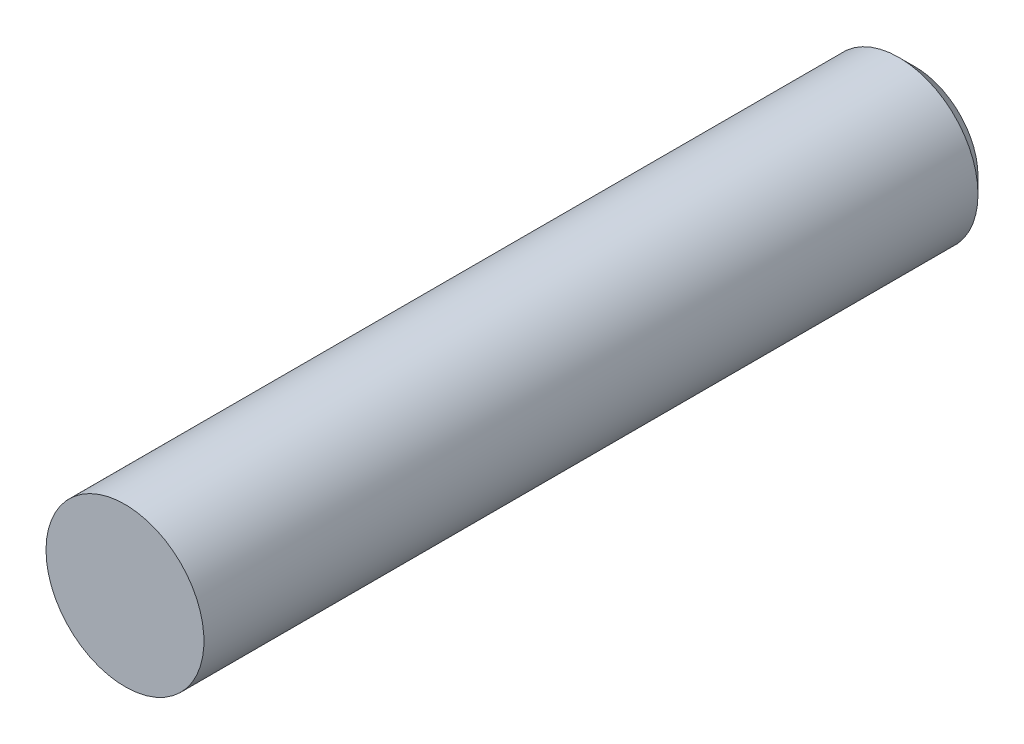
ISO-10303-21;
HEADER;
FILE_DESCRIPTION(('STEP AP214'),'2;1');
FILE_NAME('part.step','',(''),(''),'','','');
FILE_SCHEMA(('AUTOMOTIVE_DESIGN { 1 0 10303 214 1 1 1 1 }'));
ENDSEC;
DATA;
#1=APPLICATION_CONTEXT('core data for automotive mechanical design processes');
#2=APPLICATION_PROTOCOL_DEFINITION('international standard','automotive_design',2000,#1);
#3=PRODUCT_CONTEXT('',#1,'mechanical');
#4=PRODUCT('Part','Part','',(#3));
#5=PRODUCT_RELATED_PRODUCT_CATEGORY('part','',(#4));
#6=PRODUCT_DEFINITION_FORMATION('','',#4);
#7=PRODUCT_DEFINITION_CONTEXT('part definition',#1,'design');
#8=PRODUCT_DEFINITION('design','',#6,#7);
#9=PRODUCT_DEFINITION_SHAPE('','',#8);
#10=(LENGTH_UNIT() NAMED_UNIT(*) SI_UNIT(.MILLI.,.METRE.));
#11=(NAMED_UNIT(*) PLANE_ANGLE_UNIT() SI_UNIT($,.RADIAN.));
#12=(NAMED_UNIT(*) SI_UNIT($,.STERADIAN.) SOLID_ANGLE_UNIT());
#13=UNCERTAINTY_MEASURE_WITH_UNIT(LENGTH_MEASURE(1.E-05),#10,'distance_accuracy_value','');
#14=(GEOMETRIC_REPRESENTATION_CONTEXT(3) GLOBAL_UNCERTAINTY_ASSIGNED_CONTEXT((#13)) GLOBAL_UNIT_ASSIGNED_CONTEXT((#10,
#11,#12)) REPRESENTATION_CONTEXT('',''));
#15=CARTESIAN_POINT('',(0.,0.,0.));
#16=DIRECTION('',(0.,0.,1.));
#17=DIRECTION('',(1.,0.,0.));
#18=AXIS2_PLACEMENT_3D('',#15,#16,#17);
#19=CARTESIAN_POINT('',(0.,0.,100.));
#20=DIRECTION('',(0.,0.,-1.));
#21=DIRECTION('',(-1.,0.,0.));
#22=AXIS2_PLACEMENT_3D('',#19,#20,#21);
#23=CYLINDRICAL_SURFACE('',#22,2.5);
#24=CARTESIAN_POINT('',(0.,0.,-75.));
#25=DIRECTION('',(0.,0.,-1.));
#26=DIRECTION('',(-1.,0.,0.));
#27=AXIS2_PLACEMENT_3D('',#24,#25,#26);
#28=CIRCLE('',#27,2.5);
#29=CARTESIAN_POINT('',(-2.5,0.,-75.));
#30=VERTEX_POINT('',#29);
#31=EDGE_CURVE('E35',#30,#30,#28,.T.);
#32=ORIENTED_EDGE('',*,*,#31,.T.);
#33=EDGE_LOOP('',(#32));
#34=FACE_BOUND('',#33,.T.);
#35=CARTESIAN_POINT('',(0.,0.,-99.5));
#36=DIRECTION('',(0.,0.,1.));
#37=DIRECTION('',(1.,0.,0.));
#38=AXIS2_PLACEMENT_3D('',#35,#36,#37);
#39=CIRCLE('',#38,2.5);
#40=CARTESIAN_POINT('',(2.5,0.,-99.5));
#41=VERTEX_POINT('',#40);
#42=EDGE_CURVE('E39',#41,#41,#39,.T.);
#43=ORIENTED_EDGE('',*,*,#42,.T.);
#44=EDGE_LOOP('',(#43));
#45=FACE_BOUND('',#44,.T.);
#46=ADVANCED_FACE('F31',(#34,#45),#23,.T.);
#47=CARTESIAN_POINT('',(0.,0.,-100.));
#48=DIRECTION('',(0.,0.,1.));
#49=DIRECTION('',(1.,0.,0.));
#50=AXIS2_PLACEMENT_3D('',#47,#48,#49);
#51=PLANE('',#50);
#52=CARTESIAN_POINT('',(0.,0.,-100.));
#53=DIRECTION('',(0.,0.,1.));
#54=DIRECTION('',(1.,0.,0.));
#55=AXIS2_PLACEMENT_3D('',#52,#53,#54);
#56=CIRCLE('',#55,1.99999999999997);
#57=CARTESIAN_POINT('',(1.99999999999997,0.,-100.));
#58=VERTEX_POINT('',#57);
#59=EDGE_CURVE('E10',#58,#58,#56,.F.);
#60=ORIENTED_EDGE('',*,*,#59,.T.);
#61=EDGE_LOOP('',(#60));
#62=FACE_BOUND('',#61,.T.);
#63=ADVANCED_FACE('F56',(#62),#51,.F.);
#64=CARTESIAN_POINT('',(0.,0.,-99.5));
#65=DIRECTION('',(0.,0.,1.));
#66=DIRECTION('',(1.,0.,0.));
#67=AXIS2_PLACEMENT_3D('',#64,#65,#66);
#68=CONICAL_SURFACE('',#67,2.5,0.785398163397474);
#69=ORIENTED_EDGE('',*,*,#59,.F.);
#70=EDGE_LOOP('',(#69));
#71=FACE_BOUND('',#70,.T.);
#72=ORIENTED_EDGE('',*,*,#42,.F.);
#73=EDGE_LOOP('',(#72));
#74=FACE_BOUND('',#73,.T.);
#75=ADVANCED_FACE('F33',(#71,#74),#68,.T.);
#76=CARTESIAN_POINT('',(0.,0.,-75.));
#77=DIRECTION('',(0.,0.,-1.));
#78=DIRECTION('',(-1.,0.,0.));
#79=AXIS2_PLACEMENT_3D('',#76,#77,#78);
#80=PLANE('',#79);
#81=ORIENTED_EDGE('',*,*,#31,.F.);
#82=EDGE_LOOP('',(#81));
#83=FACE_BOUND('',#82,.T.);
#84=ADVANCED_FACE('F50',(#83),#80,.F.);
#85=CLOSED_SHELL('',(#46,#63,#75,#84));
#86=MANIFOLD_SOLID_BREP('B2',#85);
#87=ADVANCED_BREP_SHAPE_REPRESENTATION('',(#18,#86),#14);
#88=SHAPE_DEFINITION_REPRESENTATION(#9,#87);
ENDSEC;
END-ISO-10303-21;
